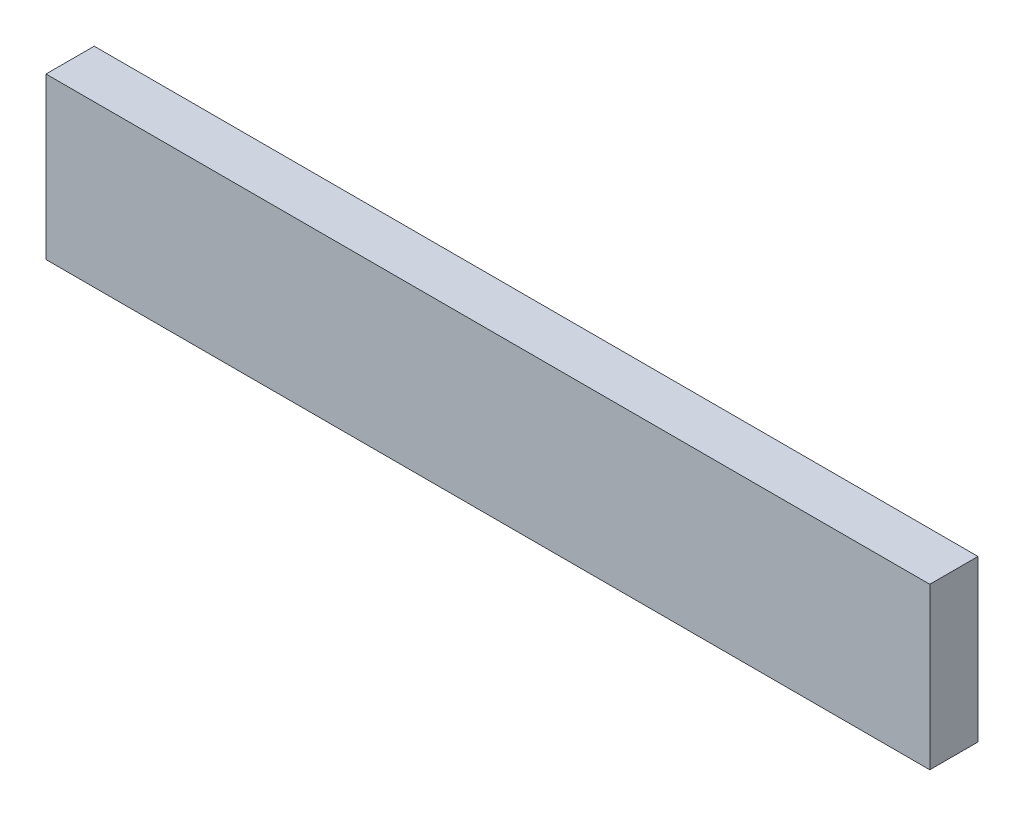
ISO-10303-21;
HEADER;
FILE_DESCRIPTION(('STEP AP214'),'2;1');
FILE_NAME('part.step','',(''),(''),'','','');
FILE_SCHEMA(('AUTOMOTIVE_DESIGN { 1 0 10303 214 1 1 1 1 }'));
ENDSEC;
DATA;
#1=APPLICATION_CONTEXT('core data for automotive mechanical design processes');
#2=APPLICATION_PROTOCOL_DEFINITION('international standard','automotive_design',2000,#1);
#3=PRODUCT_CONTEXT('',#1,'mechanical');
#4=PRODUCT('Part','Part','',(#3));
#5=PRODUCT_RELATED_PRODUCT_CATEGORY('part','',(#4));
#6=PRODUCT_DEFINITION_FORMATION('','',#4);
#7=PRODUCT_DEFINITION_CONTEXT('part definition',#1,'design');
#8=PRODUCT_DEFINITION('design','',#6,#7);
#9=PRODUCT_DEFINITION_SHAPE('','',#8);
#10=(LENGTH_UNIT() NAMED_UNIT(*) SI_UNIT(.MILLI.,.METRE.));
#11=(NAMED_UNIT(*) PLANE_ANGLE_UNIT() SI_UNIT($,.RADIAN.));
#12=(NAMED_UNIT(*) SI_UNIT($,.STERADIAN.) SOLID_ANGLE_UNIT());
#13=UNCERTAINTY_MEASURE_WITH_UNIT(LENGTH_MEASURE(1.E-05),#10,'distance_accuracy_value','');
#14=(GEOMETRIC_REPRESENTATION_CONTEXT(3) GLOBAL_UNCERTAINTY_ASSIGNED_CONTEXT((#13)) GLOBAL_UNIT_ASSIGNED_CONTEXT((#10,
#11,#12)) REPRESENTATION_CONTEXT('',''));
#15=CARTESIAN_POINT('',(0.,0.,0.));
#16=DIRECTION('',(0.,0.,1.));
#17=DIRECTION('',(1.,0.,0.));
#18=AXIS2_PLACEMENT_3D('',#15,#16,#17);
#19=CARTESIAN_POINT('',(0.,0.,3.));
#20=DIRECTION('',(1.,0.,0.));
#21=DIRECTION('',(0.,0.,-1.));
#22=AXIS2_PLACEMENT_3D('',#19,#20,#21);
#23=PLANE('',#22);
#24=DIRECTION('',(0.,-1.,0.));
#25=VECTOR('',#24,1.);
#26=CARTESIAN_POINT('',(0.,0.,0.));
#27=LINE('',#26,#25);
#28=CARTESIAN_POINT('',(0.,10.,0.));
#29=VERTEX_POINT('',#28);
#30=CARTESIAN_POINT('',(0.,0.,0.));
#31=VERTEX_POINT('',#30);
#32=EDGE_CURVE('E98',#29,#31,#27,.T.);
#33=ORIENTED_EDGE('',*,*,#32,.T.);
#34=DIRECTION('',(0.,0.,-1.));
#35=VECTOR('',#34,1.);
#36=CARTESIAN_POINT('',(0.,0.,3.));
#37=LINE('',#36,#35);
#38=CARTESIAN_POINT('',(0.,0.,3.));
#39=VERTEX_POINT('',#38);
#40=EDGE_CURVE('E11',#39,#31,#37,.T.);
#41=ORIENTED_EDGE('',*,*,#40,.F.);
#42=DIRECTION('',(0.,-1.,0.));
#43=VECTOR('',#42,1.);
#44=CARTESIAN_POINT('',(0.,0.,3.));
#45=LINE('',#44,#43);
#46=CARTESIAN_POINT('',(0.,10.,3.));
#47=VERTEX_POINT('',#46);
#48=EDGE_CURVE('E86',#47,#39,#45,.T.);
#49=ORIENTED_EDGE('',*,*,#48,.F.);
#50=DIRECTION('',(0.,0.,-1.));
#51=VECTOR('',#50,1.);
#52=CARTESIAN_POINT('',(0.,10.,3.));
#53=LINE('',#52,#51);
#54=EDGE_CURVE('E94',#47,#29,#53,.T.);
#55=ORIENTED_EDGE('',*,*,#54,.T.);
#56=EDGE_LOOP('',(#33,#41,#49,#55));
#57=FACE_BOUND('',#56,.T.);
#58=ADVANCED_FACE('F35',(#57),#23,.F.);
#59=CARTESIAN_POINT('',(0.,0.,3.));
#60=DIRECTION('',(0.,1.,0.));
#61=DIRECTION('',(0.,0.,1.));
#62=AXIS2_PLACEMENT_3D('',#59,#60,#61);
#63=PLANE('',#62);
#64=DIRECTION('',(1.,0.,0.));
#65=VECTOR('',#64,1.);
#66=CARTESIAN_POINT('',(0.,0.,0.));
#67=LINE('',#66,#65);
#68=CARTESIAN_POINT('',(55.,0.,0.));
#69=VERTEX_POINT('',#68);
#70=EDGE_CURVE('E90',#31,#69,#67,.T.);
#71=ORIENTED_EDGE('',*,*,#70,.T.);
#72=DIRECTION('',(0.,0.,-1.));
#73=VECTOR('',#72,1.);
#74=CARTESIAN_POINT('',(55.,0.,3.));
#75=LINE('',#74,#73);
#76=CARTESIAN_POINT('',(55.,0.,3.));
#77=VERTEX_POINT('',#76);
#78=EDGE_CURVE('E43',#77,#69,#75,.T.);
#79=ORIENTED_EDGE('',*,*,#78,.F.);
#80=DIRECTION('',(1.,0.,0.));
#81=VECTOR('',#80,1.);
#82=CARTESIAN_POINT('',(0.,0.,3.));
#83=LINE('',#82,#81);
#84=EDGE_CURVE('E81',#39,#77,#83,.T.);
#85=ORIENTED_EDGE('',*,*,#84,.F.);
#86=ORIENTED_EDGE('',*,*,#40,.T.);
#87=EDGE_LOOP('',(#71,#79,#85,#86));
#88=FACE_BOUND('',#87,.T.);
#89=ADVANCED_FACE('F89',(#88),#63,.F.);
#90=CARTESIAN_POINT('',(55.,0.,3.));
#91=DIRECTION('',(-1.,0.,0.));
#92=DIRECTION('',(0.,0.,1.));
#93=AXIS2_PLACEMENT_3D('',#90,#91,#92);
#94=PLANE('',#93);
#95=DIRECTION('',(0.,1.,0.));
#96=VECTOR('',#95,1.);
#97=CARTESIAN_POINT('',(55.,0.,0.));
#98=LINE('',#97,#96);
#99=CARTESIAN_POINT('',(55.,10.,0.));
#100=VERTEX_POINT('',#99);
#101=EDGE_CURVE('E68',#69,#100,#98,.T.);
#102=ORIENTED_EDGE('',*,*,#101,.T.);
#103=DIRECTION('',(0.,0.,-1.));
#104=VECTOR('',#103,1.);
#105=CARTESIAN_POINT('',(55.,10.,3.));
#106=LINE('',#105,#104);
#107=CARTESIAN_POINT('',(55.,10.,3.));
#108=VERTEX_POINT('',#107);
#109=EDGE_CURVE('E91',#108,#100,#106,.T.);
#110=ORIENTED_EDGE('',*,*,#109,.F.);
#111=DIRECTION('',(0.,1.,0.));
#112=VECTOR('',#111,1.);
#113=CARTESIAN_POINT('',(55.,0.,3.));
#114=LINE('',#113,#112);
#115=EDGE_CURVE('E84',#77,#108,#114,.T.);
#116=ORIENTED_EDGE('',*,*,#115,.F.);
#117=ORIENTED_EDGE('',*,*,#78,.T.);
#118=EDGE_LOOP('',(#102,#110,#116,#117));
#119=FACE_BOUND('',#118,.T.);
#120=ADVANCED_FACE('F92',(#119),#94,.F.);
#121=CARTESIAN_POINT('',(0.,10.,3.));
#122=DIRECTION('',(0.,-1.,0.));
#123=DIRECTION('',(0.,0.,-1.));
#124=AXIS2_PLACEMENT_3D('',#121,#122,#123);
#125=PLANE('',#124);
#126=DIRECTION('',(-1.,0.,0.));
#127=VECTOR('',#126,1.);
#128=CARTESIAN_POINT('',(0.,10.,0.));
#129=LINE('',#128,#127);
#130=EDGE_CURVE('E74',#100,#29,#129,.T.);
#131=ORIENTED_EDGE('',*,*,#130,.T.);
#132=ORIENTED_EDGE('',*,*,#54,.F.);
#133=DIRECTION('',(-1.,0.,0.));
#134=VECTOR('',#133,1.);
#135=CARTESIAN_POINT('',(0.,10.,3.));
#136=LINE('',#135,#134);
#137=EDGE_CURVE('E51',#108,#47,#136,.T.);
#138=ORIENTED_EDGE('',*,*,#137,.F.);
#139=ORIENTED_EDGE('',*,*,#109,.T.);
#140=EDGE_LOOP('',(#131,#132,#138,#139));
#141=FACE_BOUND('',#140,.T.);
#142=ADVANCED_FACE('F105',(#141),#125,.F.);
#143=CARTESIAN_POINT('',(0.,0.,3.));
#144=DIRECTION('',(0.,0.,-1.));
#145=DIRECTION('',(-1.,0.,0.));
#146=AXIS2_PLACEMENT_3D('',#143,#144,#145);
#147=PLANE('',#146);
#148=ORIENTED_EDGE('',*,*,#48,.T.);
#149=ORIENTED_EDGE('',*,*,#84,.T.);
#150=ORIENTED_EDGE('',*,*,#115,.T.);
#151=ORIENTED_EDGE('',*,*,#137,.T.);
#152=EDGE_LOOP('',(#148,#149,#150,#151));
#153=FACE_BOUND('',#152,.T.);
#154=ADVANCED_FACE('F82',(#153),#147,.F.);
#155=CARTESIAN_POINT('',(0.,0.,0.));
#156=DIRECTION('',(0.,0.,-1.));
#157=DIRECTION('',(-1.,0.,0.));
#158=AXIS2_PLACEMENT_3D('',#155,#156,#157);
#159=PLANE('',#158);
#160=ORIENTED_EDGE('',*,*,#32,.F.);
#161=ORIENTED_EDGE('',*,*,#130,.F.);
#162=ORIENTED_EDGE('',*,*,#101,.F.);
#163=ORIENTED_EDGE('',*,*,#70,.F.);
#164=EDGE_LOOP('',(#160,#161,#162,#163));
#165=FACE_BOUND('',#164,.T.);
#166=ADVANCED_FACE('F108',(#165),#159,.T.);
#167=CLOSED_SHELL('',(#58,#89,#120,#142,#154,#166));
#168=MANIFOLD_SOLID_BREP('B2',#167);
#169=ADVANCED_BREP_SHAPE_REPRESENTATION('',(#18,#168),#14);
#170=SHAPE_DEFINITION_REPRESENTATION(#9,#169);
ENDSEC;
END-ISO-10303-21;
